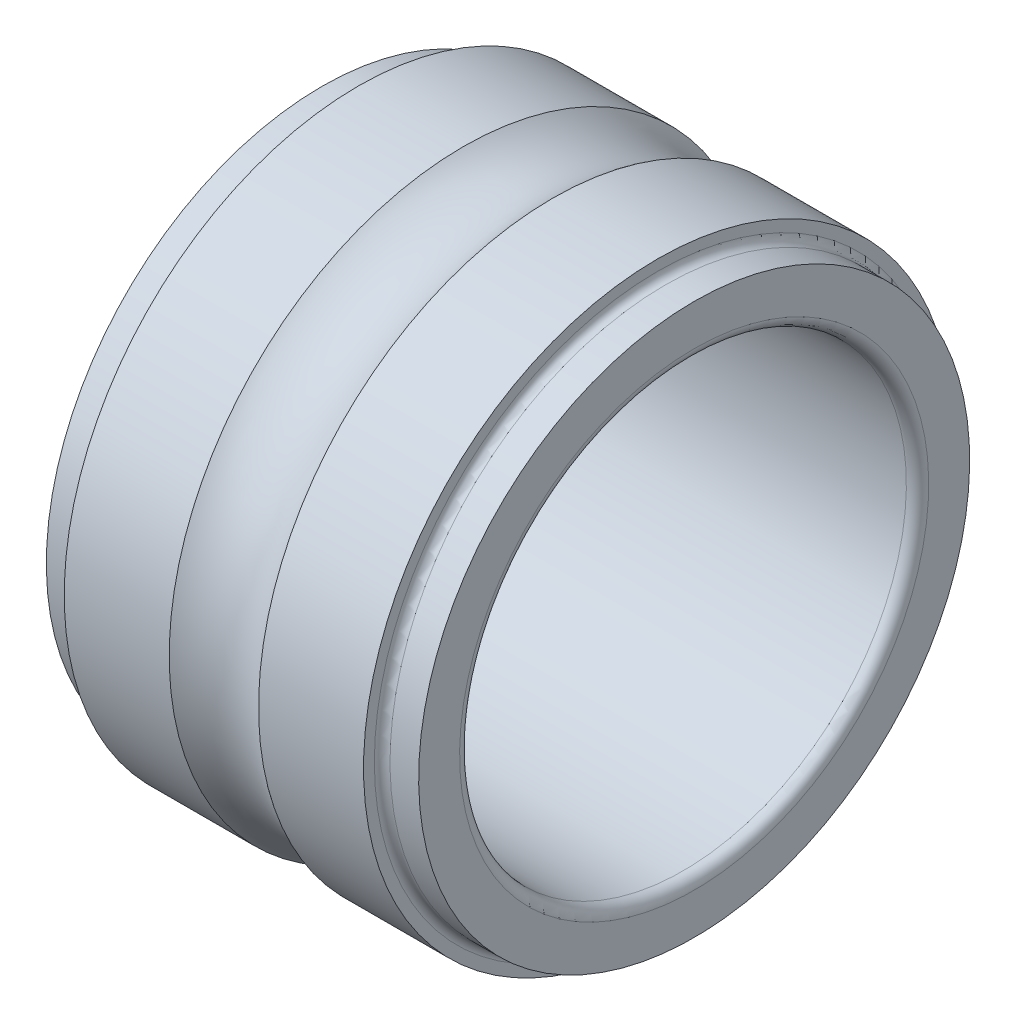
ISO-10303-21;
HEADER;
FILE_DESCRIPTION(('STEP AP214'),'2;1');
FILE_NAME('part.step','',(''),(''),'','','');
FILE_SCHEMA(('AUTOMOTIVE_DESIGN { 1 0 10303 214 1 1 1 1 }'));
ENDSEC;
DATA;
#1=APPLICATION_CONTEXT('core data for automotive mechanical design processes');
#2=APPLICATION_PROTOCOL_DEFINITION('international standard','automotive_design',2000,#1);
#3=PRODUCT_CONTEXT('',#1,'mechanical');
#4=PRODUCT('Part','Part','',(#3));
#5=PRODUCT_RELATED_PRODUCT_CATEGORY('part','',(#4));
#6=PRODUCT_DEFINITION_FORMATION('','',#4);
#7=PRODUCT_DEFINITION_CONTEXT('part definition',#1,'design');
#8=PRODUCT_DEFINITION('design','',#6,#7);
#9=PRODUCT_DEFINITION_SHAPE('','',#8);
#10=(LENGTH_UNIT() NAMED_UNIT(*) SI_UNIT(.MILLI.,.METRE.));
#11=(NAMED_UNIT(*) PLANE_ANGLE_UNIT() SI_UNIT($,.RADIAN.));
#12=(NAMED_UNIT(*) SI_UNIT($,.STERADIAN.) SOLID_ANGLE_UNIT());
#13=UNCERTAINTY_MEASURE_WITH_UNIT(LENGTH_MEASURE(1.E-05),#10,'distance_accuracy_value','');
#14=(GEOMETRIC_REPRESENTATION_CONTEXT(3) GLOBAL_UNCERTAINTY_ASSIGNED_CONTEXT((#13)) GLOBAL_UNIT_ASSIGNED_CONTEXT((#10,
#11,#12)) REPRESENTATION_CONTEXT('',''));
#15=CARTESIAN_POINT('',(0.,0.,0.));
#16=DIRECTION('',(0.,0.,1.));
#17=DIRECTION('',(1.,0.,0.));
#18=AXIS2_PLACEMENT_3D('',#15,#16,#17);
#19=CARTESIAN_POINT('',(3.805,0.,0.));
#20=DIRECTION('',(-1.,0.,0.));
#21=DIRECTION('',(0.,1.,0.));
#22=AXIS2_PLACEMENT_3D('',#19,#20,#21);
#23=CYLINDRICAL_SURFACE('',#22,3.95);
#24=CARTESIAN_POINT('',(3.1,0.,0.));
#25=DIRECTION('',(1.,0.,0.));
#26=DIRECTION('',(0.,1.,0.));
#27=AXIS2_PLACEMENT_3D('',#24,#25,#26);
#28=CIRCLE('',#27,3.95);
#29=CARTESIAN_POINT('',(3.1,3.95,0.));
#30=VERTEX_POINT('',#29);
#31=EDGE_CURVE('E11',#30,#30,#28,.T.);
#32=ORIENTED_EDGE('',*,*,#31,.T.);
#33=EDGE_LOOP('',(#32));
#34=FACE_BOUND('',#33,.T.);
#35=CARTESIAN_POINT('',(4.51,0.,0.));
#36=DIRECTION('',(1.,0.,0.));
#37=DIRECTION('',(0.,1.,0.));
#38=AXIS2_PLACEMENT_3D('',#35,#36,#37);
#39=CIRCLE('',#38,3.95);
#40=CARTESIAN_POINT('',(4.51,3.95,0.));
#41=VERTEX_POINT('',#40);
#42=EDGE_CURVE('E51',#41,#41,#39,.T.);
#43=ORIENTED_EDGE('',*,*,#42,.F.);
#44=EDGE_LOOP('',(#43));
#45=FACE_BOUND('',#44,.T.);
#46=ADVANCED_FACE('F16',(#34,#45),#23,.T.);
#47=CARTESIAN_POINT('',(2.5,0.,0.));
#48=DIRECTION('',(1.,0.,0.));
#49=DIRECTION('',(0.,0.,-1.));
#50=AXIS2_PLACEMENT_3D('',#47,#48,#49);
#51=TOROIDAL_SURFACE('',#50,4.75,1.);
#52=CARTESIAN_POINT('',(1.9,0.,0.));
#53=DIRECTION('',(1.,0.,0.));
#54=DIRECTION('',(0.,1.,0.));
#55=AXIS2_PLACEMENT_3D('',#52,#53,#54);
#56=CIRCLE('',#55,3.95);
#57=CARTESIAN_POINT('',(1.9,3.95,0.));
#58=VERTEX_POINT('',#57);
#59=EDGE_CURVE('E26',#58,#58,#56,.T.);
#60=ORIENTED_EDGE('',*,*,#59,.T.);
#61=EDGE_LOOP('',(#60));
#62=FACE_BOUND('',#61,.T.);
#63=ORIENTED_EDGE('',*,*,#31,.F.);
#64=EDGE_LOOP('',(#63));
#65=FACE_BOUND('',#64,.T.);
#66=ADVANCED_FACE('F130',(#62,#65),#51,.F.);
#67=CARTESIAN_POINT('',(1.195,0.,0.));
#68=DIRECTION('',(-1.,0.,0.));
#69=DIRECTION('',(0.,1.,0.));
#70=AXIS2_PLACEMENT_3D('',#67,#68,#69);
#71=CYLINDRICAL_SURFACE('',#70,3.95);
#72=CARTESIAN_POINT('',(0.49,0.,0.));
#73=DIRECTION('',(1.,0.,0.));
#74=DIRECTION('',(0.,1.,0.));
#75=AXIS2_PLACEMENT_3D('',#72,#73,#74);
#76=CIRCLE('',#75,3.95);
#77=CARTESIAN_POINT('',(0.49,3.95,0.));
#78=VERTEX_POINT('',#77);
#79=EDGE_CURVE('E82',#78,#78,#76,.T.);
#80=ORIENTED_EDGE('',*,*,#79,.T.);
#81=EDGE_LOOP('',(#80));
#82=FACE_BOUND('',#81,.T.);
#83=ORIENTED_EDGE('',*,*,#59,.F.);
#84=EDGE_LOOP('',(#83));
#85=FACE_BOUND('',#84,.T.);
#86=ADVANCED_FACE('F135',(#82,#85),#71,.T.);
#87=CARTESIAN_POINT('',(0.49,3.8775,0.));
#88=DIRECTION('',(-1.,0.,0.));
#89=DIRECTION('',(0.,-1.,0.));
#90=AXIS2_PLACEMENT_3D('',#87,#88,#89);
#91=PLANE('',#90);
#92=CARTESIAN_POINT('',(0.49,0.,0.));
#93=DIRECTION('',(1.,0.,0.));
#94=DIRECTION('',(0.,1.,0.));
#95=AXIS2_PLACEMENT_3D('',#92,#93,#94);
#96=CIRCLE('',#95,3.805);
#97=CARTESIAN_POINT('',(0.49,3.805,0.));
#98=VERTEX_POINT('',#97);
#99=EDGE_CURVE('E20',#98,#98,#96,.T.);
#100=ORIENTED_EDGE('',*,*,#99,.T.);
#101=EDGE_LOOP('',(#100));
#102=FACE_BOUND('',#101,.T.);
#103=ORIENTED_EDGE('',*,*,#79,.F.);
#104=EDGE_LOOP('',(#103));
#105=FACE_BOUND('',#104,.T.);
#106=ADVANCED_FACE('F86',(#102,#105),#91,.T.);
#107=CARTESIAN_POINT('',(0.385,0.,0.));
#108=DIRECTION('',(1.,0.,0.));
#109=DIRECTION('',(0.,0.,-1.));
#110=AXIS2_PLACEMENT_3D('',#107,#108,#109);
#111=TOROIDAL_SURFACE('',#110,3.805,0.105);
#112=CARTESIAN_POINT('',(0.385,0.,0.));
#113=DIRECTION('',(1.,0.,0.));
#114=DIRECTION('',(0.,1.,0.));
#115=AXIS2_PLACEMENT_3D('',#112,#113,#114);
#116=CIRCLE('',#115,3.7);
#117=CARTESIAN_POINT('',(0.385,3.7,0.));
#118=VERTEX_POINT('',#117);
#119=EDGE_CURVE('E89',#118,#118,#116,.T.);
#120=ORIENTED_EDGE('',*,*,#119,.T.);
#121=EDGE_LOOP('',(#120));
#122=FACE_BOUND('',#121,.T.);
#123=ORIENTED_EDGE('',*,*,#99,.F.);
#124=EDGE_LOOP('',(#123));
#125=FACE_BOUND('',#124,.T.);
#126=ADVANCED_FACE('F18',(#122,#125),#111,.F.);
#127=CARTESIAN_POINT('',(0.1925,0.,0.));
#128=DIRECTION('',(-1.,0.,0.));
#129=DIRECTION('',(0.,1.,0.));
#130=AXIS2_PLACEMENT_3D('',#127,#128,#129);
#131=CYLINDRICAL_SURFACE('',#130,3.7);
#132=CARTESIAN_POINT('',(0.,0.,0.));
#133=DIRECTION('',(1.,0.,0.));
#134=DIRECTION('',(0.,1.,0.));
#135=AXIS2_PLACEMENT_3D('',#132,#133,#134);
#136=CIRCLE('',#135,3.7);
#137=CARTESIAN_POINT('',(0.,3.7,0.));
#138=VERTEX_POINT('',#137);
#139=EDGE_CURVE('E91',#138,#138,#136,.T.);
#140=ORIENTED_EDGE('',*,*,#139,.T.);
#141=EDGE_LOOP('',(#140));
#142=FACE_BOUND('',#141,.T.);
#143=ORIENTED_EDGE('',*,*,#119,.F.);
#144=EDGE_LOOP('',(#143));
#145=FACE_BOUND('',#144,.T.);
#146=ADVANCED_FACE('F125',(#142,#145),#131,.T.);
#147=CARTESIAN_POINT('',(0.,3.425,0.));
#148=DIRECTION('',(-1.,0.,0.));
#149=DIRECTION('',(0.,-1.,0.));
#150=AXIS2_PLACEMENT_3D('',#147,#148,#149);
#151=PLANE('',#150);
#152=CARTESIAN_POINT('',(0.,0.,0.));
#153=DIRECTION('',(1.,0.,0.));
#154=DIRECTION('',(0.,1.,0.));
#155=AXIS2_PLACEMENT_3D('',#152,#153,#154);
#156=CIRCLE('',#155,3.15);
#157=CARTESIAN_POINT('',(0.,3.15,0.));
#158=VERTEX_POINT('',#157);
#159=EDGE_CURVE('E96',#158,#158,#156,.T.);
#160=ORIENTED_EDGE('',*,*,#159,.T.);
#161=EDGE_LOOP('',(#160));
#162=FACE_BOUND('',#161,.T.);
#163=ORIENTED_EDGE('',*,*,#139,.F.);
#164=EDGE_LOOP('',(#163));
#165=FACE_BOUND('',#164,.T.);
#166=ADVANCED_FACE('F110',(#162,#165),#151,.T.);
#167=CARTESIAN_POINT('',(0.15,0.,0.));
#168=DIRECTION('',(1.,0.,0.));
#169=DIRECTION('',(0.,0.,-1.));
#170=AXIS2_PLACEMENT_3D('',#167,#168,#169);
#171=TOROIDAL_SURFACE('',#170,3.15,0.15);
#172=CARTESIAN_POINT('',(0.15,0.,0.));
#173=DIRECTION('',(1.,0.,0.));
#174=DIRECTION('',(0.,1.,0.));
#175=AXIS2_PLACEMENT_3D('',#172,#173,#174);
#176=CIRCLE('',#175,3.);
#177=CARTESIAN_POINT('',(0.15,3.,0.));
#178=VERTEX_POINT('',#177);
#179=EDGE_CURVE('E105',#178,#178,#176,.T.);
#180=ORIENTED_EDGE('',*,*,#179,.T.);
#181=EDGE_LOOP('',(#180));
#182=FACE_BOUND('',#181,.T.);
#183=ORIENTED_EDGE('',*,*,#159,.F.);
#184=EDGE_LOOP('',(#183));
#185=FACE_BOUND('',#184,.T.);
#186=ADVANCED_FACE('F113',(#182,#185),#171,.T.);
#187=CARTESIAN_POINT('',(2.5,0.,0.));
#188=DIRECTION('',(-1.,0.,0.));
#189=DIRECTION('',(0.,1.,0.));
#190=AXIS2_PLACEMENT_3D('',#187,#188,#189);
#191=CYLINDRICAL_SURFACE('',#190,3.);
#192=CARTESIAN_POINT('',(4.85,0.,0.));
#193=DIRECTION('',(1.,0.,0.));
#194=DIRECTION('',(0.,1.,0.));
#195=AXIS2_PLACEMENT_3D('',#192,#193,#194);
#196=CIRCLE('',#195,3.);
#197=CARTESIAN_POINT('',(4.85,3.,0.));
#198=VERTEX_POINT('',#197);
#199=EDGE_CURVE('E67',#198,#198,#196,.T.);
#200=ORIENTED_EDGE('',*,*,#199,.T.);
#201=EDGE_LOOP('',(#200));
#202=FACE_BOUND('',#201,.T.);
#203=ORIENTED_EDGE('',*,*,#179,.F.);
#204=EDGE_LOOP('',(#203));
#205=FACE_BOUND('',#204,.T.);
#206=ADVANCED_FACE('F115',(#202,#205),#191,.F.);
#207=CARTESIAN_POINT('',(4.85,0.,0.));
#208=DIRECTION('',(1.,0.,0.));
#209=DIRECTION('',(0.,0.,-1.));
#210=AXIS2_PLACEMENT_3D('',#207,#208,#209);
#211=TOROIDAL_SURFACE('',#210,3.15,0.15);
#212=CARTESIAN_POINT('',(5.,0.,0.));
#213=DIRECTION('',(1.,0.,0.));
#214=DIRECTION('',(0.,1.,0.));
#215=AXIS2_PLACEMENT_3D('',#212,#213,#214);
#216=CIRCLE('',#215,3.15);
#217=CARTESIAN_POINT('',(5.,3.15,0.));
#218=VERTEX_POINT('',#217);
#219=EDGE_CURVE('E73',#218,#218,#216,.T.);
#220=ORIENTED_EDGE('',*,*,#219,.T.);
#221=EDGE_LOOP('',(#220));
#222=FACE_BOUND('',#221,.T.);
#223=ORIENTED_EDGE('',*,*,#199,.F.);
#224=EDGE_LOOP('',(#223));
#225=FACE_BOUND('',#224,.T.);
#226=ADVANCED_FACE('F123',(#222,#225),#211,.T.);
#227=CARTESIAN_POINT('',(5.,3.425,0.));
#228=DIRECTION('',(1.,0.,0.));
#229=DIRECTION('',(0.,1.,0.));
#230=AXIS2_PLACEMENT_3D('',#227,#228,#229);
#231=PLANE('',#230);
#232=CARTESIAN_POINT('',(5.,0.,0.));
#233=DIRECTION('',(1.,0.,0.));
#234=DIRECTION('',(0.,1.,0.));
#235=AXIS2_PLACEMENT_3D('',#232,#233,#234);
#236=CIRCLE('',#235,3.7);
#237=CARTESIAN_POINT('',(5.,3.7,0.));
#238=VERTEX_POINT('',#237);
#239=EDGE_CURVE('E77',#238,#238,#236,.T.);
#240=ORIENTED_EDGE('',*,*,#239,.T.);
#241=EDGE_LOOP('',(#240));
#242=FACE_BOUND('',#241,.T.);
#243=ORIENTED_EDGE('',*,*,#219,.F.);
#244=EDGE_LOOP('',(#243));
#245=FACE_BOUND('',#244,.T.);
#246=ADVANCED_FACE('F145',(#242,#245),#231,.T.);
#247=CARTESIAN_POINT('',(4.8075,0.,0.));
#248=DIRECTION('',(-1.,0.,0.));
#249=DIRECTION('',(0.,1.,0.));
#250=AXIS2_PLACEMENT_3D('',#247,#248,#249);
#251=CYLINDRICAL_SURFACE('',#250,3.7);
#252=CARTESIAN_POINT('',(4.615,0.,0.));
#253=DIRECTION('',(1.,0.,0.));
#254=DIRECTION('',(0.,1.,0.));
#255=AXIS2_PLACEMENT_3D('',#252,#253,#254);
#256=CIRCLE('',#255,3.7);
#257=CARTESIAN_POINT('',(4.615,3.7,0.));
#258=VERTEX_POINT('',#257);
#259=EDGE_CURVE('E100',#258,#258,#256,.T.);
#260=ORIENTED_EDGE('',*,*,#259,.T.);
#261=EDGE_LOOP('',(#260));
#262=FACE_BOUND('',#261,.T.);
#263=ORIENTED_EDGE('',*,*,#239,.F.);
#264=EDGE_LOOP('',(#263));
#265=FACE_BOUND('',#264,.T.);
#266=ADVANCED_FACE('F143',(#262,#265),#251,.T.);
#267=CARTESIAN_POINT('',(4.615,0.,0.));
#268=DIRECTION('',(1.,0.,0.));
#269=DIRECTION('',(0.,0.,-1.));
#270=AXIS2_PLACEMENT_3D('',#267,#268,#269);
#271=TOROIDAL_SURFACE('',#270,3.805,0.105);
#272=CARTESIAN_POINT('',(4.51,0.,0.));
#273=DIRECTION('',(1.,0.,0.));
#274=DIRECTION('',(0.,1.,0.));
#275=AXIS2_PLACEMENT_3D('',#272,#273,#274);
#276=CIRCLE('',#275,3.805);
#277=CARTESIAN_POINT('',(4.51,3.805,0.));
#278=VERTEX_POINT('',#277);
#279=EDGE_CURVE('E56',#278,#278,#276,.T.);
#280=ORIENTED_EDGE('',*,*,#279,.T.);
#281=EDGE_LOOP('',(#280));
#282=FACE_BOUND('',#281,.T.);
#283=ORIENTED_EDGE('',*,*,#259,.F.);
#284=EDGE_LOOP('',(#283));
#285=FACE_BOUND('',#284,.T.);
#286=ADVANCED_FACE('F141',(#282,#285),#271,.F.);
#287=CARTESIAN_POINT('',(4.51,3.8775,0.));
#288=DIRECTION('',(1.,0.,0.));
#289=DIRECTION('',(0.,1.,0.));
#290=AXIS2_PLACEMENT_3D('',#287,#288,#289);
#291=PLANE('',#290);
#292=ORIENTED_EDGE('',*,*,#42,.T.);
#293=EDGE_LOOP('',(#292));
#294=FACE_BOUND('',#293,.T.);
#295=ORIENTED_EDGE('',*,*,#279,.F.);
#296=EDGE_LOOP('',(#295));
#297=FACE_BOUND('',#296,.T.);
#298=ADVANCED_FACE('F139',(#294,#297),#291,.T.);
#299=CLOSED_SHELL('',(#46,#66,#86,#106,#126,#146,#166,#186,#206,#226,#246,#266,#286,#298));
#300=MANIFOLD_SOLID_BREP('B1',#299);
#301=ADVANCED_BREP_SHAPE_REPRESENTATION('',(#18,#300),#14);
#302=SHAPE_DEFINITION_REPRESENTATION(#9,#301);
ENDSEC;
END-ISO-10303-21;
